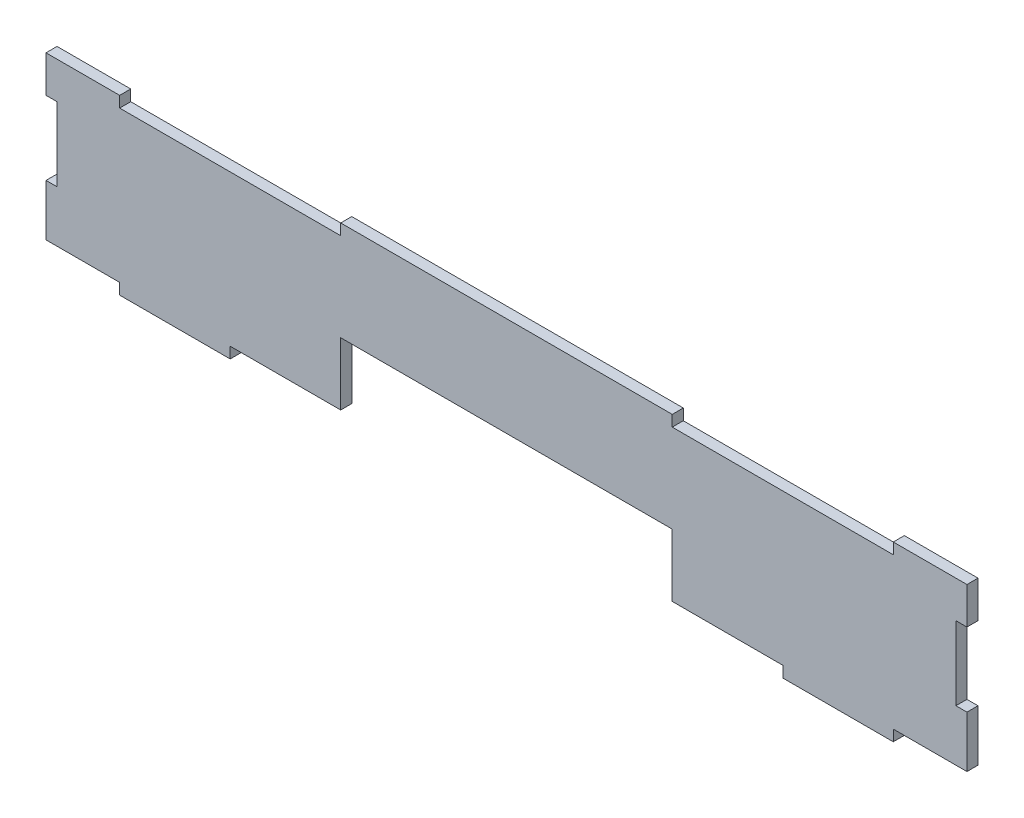
ISO-10303-21;
HEADER;
FILE_DESCRIPTION(('STEP AP214'),'2;1');
FILE_NAME('part.step','',(''),(''),'','','');
FILE_SCHEMA(('AUTOMOTIVE_DESIGN { 1 0 10303 214 1 1 1 1 }'));
ENDSEC;
DATA;
#1=APPLICATION_CONTEXT('core data for automotive mechanical design processes');
#2=APPLICATION_PROTOCOL_DEFINITION('international standard','automotive_design',2000,#1);
#3=PRODUCT_CONTEXT('',#1,'mechanical');
#4=PRODUCT('Part','Part','',(#3));
#5=PRODUCT_RELATED_PRODUCT_CATEGORY('part','',(#4));
#6=PRODUCT_DEFINITION_FORMATION('','',#4);
#7=PRODUCT_DEFINITION_CONTEXT('part definition',#1,'design');
#8=PRODUCT_DEFINITION('design','',#6,#7);
#9=PRODUCT_DEFINITION_SHAPE('','',#8);
#10=(LENGTH_UNIT() NAMED_UNIT(*) SI_UNIT(.MILLI.,.METRE.));
#11=(NAMED_UNIT(*) PLANE_ANGLE_UNIT() SI_UNIT($,.RADIAN.));
#12=(NAMED_UNIT(*) SI_UNIT($,.STERADIAN.) SOLID_ANGLE_UNIT());
#13=UNCERTAINTY_MEASURE_WITH_UNIT(LENGTH_MEASURE(1.E-05),#10,'distance_accuracy_value','');
#14=(GEOMETRIC_REPRESENTATION_CONTEXT(3) GLOBAL_UNCERTAINTY_ASSIGNED_CONTEXT((#13)) GLOBAL_UNIT_ASSIGNED_CONTEXT((#10,
#11,#12)) REPRESENTATION_CONTEXT('',''));
#15=CARTESIAN_POINT('',(0.,0.,0.));
#16=DIRECTION('',(0.,0.,1.));
#17=DIRECTION('',(1.,0.,0.));
#18=AXIS2_PLACEMENT_3D('',#15,#16,#17);
#19=CARTESIAN_POINT('',(0.,0.,3.));
#20=DIRECTION('',(0.,1.,0.));
#21=DIRECTION('',(0.,0.,1.));
#22=AXIS2_PLACEMENT_3D('',#19,#20,#21);
#23=PLANE('',#22);
#24=DIRECTION('',(1.,0.,0.));
#25=VECTOR('',#24,1.);
#26=CARTESIAN_POINT('',(0.,0.,0.));
#27=LINE('',#26,#25);
#28=CARTESIAN_POINT('',(20.,0.,0.));
#29=VERTEX_POINT('',#28);
#30=CARTESIAN_POINT('',(50.,0.,0.));
#31=VERTEX_POINT('',#30);
#32=EDGE_CURVE('E286',#29,#31,#27,.T.);
#33=ORIENTED_EDGE('',*,*,#32,.T.);
#34=DIRECTION('',(0.,0.,1.));
#35=VECTOR('',#34,1.);
#36=CARTESIAN_POINT('',(50.,0.,-7.));
#37=LINE('',#36,#35);
#38=CARTESIAN_POINT('',(50.,0.,3.));
#39=VERTEX_POINT('',#38);
#40=EDGE_CURVE('E542',#31,#39,#37,.T.);
#41=ORIENTED_EDGE('',*,*,#40,.T.);
#42=DIRECTION('',(1.,0.,0.));
#43=VECTOR('',#42,1.);
#44=CARTESIAN_POINT('',(0.,0.,3.));
#45=LINE('',#44,#43);
#46=CARTESIAN_POINT('',(20.,0.,3.));
#47=VERTEX_POINT('',#46);
#48=EDGE_CURVE('E263',#47,#39,#45,.T.);
#49=ORIENTED_EDGE('',*,*,#48,.F.);
#50=DIRECTION('',(0.,0.,1.));
#51=VECTOR('',#50,1.);
#52=CARTESIAN_POINT('',(20.,0.,-7.));
#53=LINE('',#52,#51);
#54=EDGE_CURVE('E337',#29,#47,#53,.T.);
#55=ORIENTED_EDGE('',*,*,#54,.F.);
#56=EDGE_LOOP('',(#33,#41,#49,#55));
#57=FACE_BOUND('',#56,.T.);
#58=ADVANCED_FACE('F33',(#57),#23,.F.);
#59=CARTESIAN_POINT('',(0.,46.98,3.));
#60=DIRECTION('',(0.,-1.,0.));
#61=DIRECTION('',(0.,0.,-1.));
#62=AXIS2_PLACEMENT_3D('',#59,#60,#61);
#63=PLANE('',#62);
#64=DIRECTION('',(-1.,0.,0.));
#65=VECTOR('',#64,1.);
#66=CARTESIAN_POINT('',(0.,46.98,0.));
#67=LINE('',#66,#65);
#68=CARTESIAN_POINT('',(250.,46.98,0.));
#69=VERTEX_POINT('',#68);
#70=CARTESIAN_POINT('',(230.,46.98,0.));
#71=VERTEX_POINT('',#70);
#72=EDGE_CURVE('E293',#69,#71,#67,.T.);
#73=ORIENTED_EDGE('',*,*,#72,.T.);
#74=DIRECTION('',(0.,0.,1.));
#75=VECTOR('',#74,1.);
#76=CARTESIAN_POINT('',(230.,46.98,0.));
#77=LINE('',#76,#75);
#78=CARTESIAN_POINT('',(230.,46.98,3.));
#79=VERTEX_POINT('',#78);
#80=EDGE_CURVE('E362',#71,#79,#77,.T.);
#81=ORIENTED_EDGE('',*,*,#80,.T.);
#82=DIRECTION('',(-1.,0.,0.));
#83=VECTOR('',#82,1.);
#84=CARTESIAN_POINT('',(0.,46.98,3.));
#85=LINE('',#84,#83);
#86=CARTESIAN_POINT('',(250.,46.98,3.));
#87=VERTEX_POINT('',#86);
#88=EDGE_CURVE('E276',#87,#79,#85,.T.);
#89=ORIENTED_EDGE('',*,*,#88,.F.);
#90=DIRECTION('',(0.,0.,-1.));
#91=VECTOR('',#90,1.);
#92=CARTESIAN_POINT('',(250.,46.98,3.));
#93=LINE('',#92,#91);
#94=EDGE_CURVE('E299',#87,#69,#93,.T.);
#95=ORIENTED_EDGE('',*,*,#94,.T.);
#96=EDGE_LOOP('',(#73,#81,#89,#95));
#97=FACE_BOUND('',#96,.T.);
#98=ADVANCED_FACE('F470',(#97),#63,.F.);
#99=CARTESIAN_POINT('',(20.,46.98,3.));
#100=VERTEX_POINT('',#99);
#101=CARTESIAN_POINT('',(0.,46.98,3.));
#102=VERTEX_POINT('',#101);
#103=EDGE_CURVE('E275',#100,#102,#85,.T.);
#104=ORIENTED_EDGE('',*,*,#103,.F.);
#105=DIRECTION('',(0.,0.,1.));
#106=VECTOR('',#105,1.);
#107=CARTESIAN_POINT('',(20.,46.98,0.));
#108=LINE('',#107,#106);
#109=CARTESIAN_POINT('',(20.,46.98,0.));
#110=VERTEX_POINT('',#109);
#111=EDGE_CURVE('E396',#110,#100,#108,.T.);
#112=ORIENTED_EDGE('',*,*,#111,.F.);
#113=CARTESIAN_POINT('',(0.,46.98,0.));
#114=VERTEX_POINT('',#113);
#115=EDGE_CURVE('E292',#110,#114,#67,.T.);
#116=ORIENTED_EDGE('',*,*,#115,.T.);
#117=DIRECTION('',(0.,0.,-1.));
#118=VECTOR('',#117,1.);
#119=CARTESIAN_POINT('',(0.,46.98,3.));
#120=LINE('',#119,#118);
#121=EDGE_CURVE('E279',#102,#114,#120,.T.);
#122=ORIENTED_EDGE('',*,*,#121,.F.);
#123=EDGE_LOOP('',(#104,#112,#116,#122));
#124=FACE_BOUND('',#123,.T.);
#125=ADVANCED_FACE('F497',(#124),#63,.F.);
#126=CARTESIAN_POINT('',(0.,0.,3.));
#127=DIRECTION('',(1.,0.,0.));
#128=DIRECTION('',(0.,0.,-1.));
#129=AXIS2_PLACEMENT_3D('',#126,#127,#128);
#130=PLANE('',#129);
#131=DIRECTION('',(0.,-1.,0.));
#132=VECTOR('',#131,1.);
#133=CARTESIAN_POINT('',(0.,0.,0.));
#134=LINE('',#133,#132);
#135=CARTESIAN_POINT('',(0.,36.98,0.));
#136=VERTEX_POINT('',#135);
#137=EDGE_CURVE('E281',#114,#136,#134,.T.);
#138=ORIENTED_EDGE('',*,*,#137,.T.);
#139=DIRECTION('',(0.,0.,1.));
#140=VECTOR('',#139,1.);
#141=CARTESIAN_POINT('',(0.,36.98,0.));
#142=LINE('',#141,#140);
#143=CARTESIAN_POINT('',(0.,36.98,3.));
#144=VERTEX_POINT('',#143);
#145=EDGE_CURVE('E422',#136,#144,#142,.T.);
#146=ORIENTED_EDGE('',*,*,#145,.T.);
#147=DIRECTION('',(0.,-1.,0.));
#148=VECTOR('',#147,1.);
#149=CARTESIAN_POINT('',(0.,0.,3.));
#150=LINE('',#149,#148);
#151=EDGE_CURVE('E264',#102,#144,#150,.T.);
#152=ORIENTED_EDGE('',*,*,#151,.F.);
#153=ORIENTED_EDGE('',*,*,#121,.T.);
#154=EDGE_LOOP('',(#138,#146,#152,#153));
#155=FACE_BOUND('',#154,.T.);
#156=ADVANCED_FACE('F501',(#155),#130,.F.);
#157=CARTESIAN_POINT('',(250.,0.,3.));
#158=DIRECTION('',(-1.,0.,0.));
#159=DIRECTION('',(0.,0.,1.));
#160=AXIS2_PLACEMENT_3D('',#157,#158,#159);
#161=PLANE('',#160);
#162=DIRECTION('',(0.,1.,0.));
#163=VECTOR('',#162,1.);
#164=CARTESIAN_POINT('',(250.,0.,3.));
#165=LINE('',#164,#163);
#166=CARTESIAN_POINT('',(250.,3.,3.));
#167=VERTEX_POINT('',#166);
#168=CARTESIAN_POINT('',(250.,16.98,3.));
#169=VERTEX_POINT('',#168);
#170=EDGE_CURVE('E273',#167,#169,#165,.T.);
#171=ORIENTED_EDGE('',*,*,#170,.F.);
#172=DIRECTION('',(0.,0.,1.));
#173=VECTOR('',#172,1.);
#174=CARTESIAN_POINT('',(250.,3.,-7.));
#175=LINE('',#174,#173);
#176=CARTESIAN_POINT('',(250.,3.,0.));
#177=VERTEX_POINT('',#176);
#178=EDGE_CURVE('E551',#177,#167,#175,.T.);
#179=ORIENTED_EDGE('',*,*,#178,.F.);
#180=DIRECTION('',(0.,1.,0.));
#181=VECTOR('',#180,1.);
#182=CARTESIAN_POINT('',(250.,0.,0.));
#183=LINE('',#182,#181);
#184=CARTESIAN_POINT('',(250.,16.98,0.));
#185=VERTEX_POINT('',#184);
#186=EDGE_CURVE('E290',#177,#185,#183,.T.);
#187=ORIENTED_EDGE('',*,*,#186,.T.);
#188=DIRECTION('',(0.,0.,1.));
#189=VECTOR('',#188,1.);
#190=CARTESIAN_POINT('',(250.,16.98,0.));
#191=LINE('',#190,#189);
#192=EDGE_CURVE('E449',#185,#169,#191,.T.);
#193=ORIENTED_EDGE('',*,*,#192,.T.);
#194=EDGE_LOOP('',(#171,#179,#187,#193));
#195=FACE_BOUND('',#194,.T.);
#196=ADVANCED_FACE('F571',(#195),#161,.F.);
#197=CARTESIAN_POINT('',(0.,16.98,0.));
#198=VERTEX_POINT('',#197);
#199=CARTESIAN_POINT('',(0.,3.,0.));
#200=VERTEX_POINT('',#199);
#201=EDGE_CURVE('E285',#198,#200,#134,.T.);
#202=ORIENTED_EDGE('',*,*,#201,.T.);
#203=DIRECTION('',(0.,0.,1.));
#204=VECTOR('',#203,1.);
#205=CARTESIAN_POINT('',(0.,3.,-7.));
#206=LINE('',#205,#204);
#207=CARTESIAN_POINT('',(0.,3.,3.));
#208=VERTEX_POINT('',#207);
#209=EDGE_CURVE('E328',#200,#208,#206,.T.);
#210=ORIENTED_EDGE('',*,*,#209,.T.);
#211=CARTESIAN_POINT('',(0.,16.98,3.));
#212=VERTEX_POINT('',#211);
#213=EDGE_CURVE('E269',#212,#208,#150,.T.);
#214=ORIENTED_EDGE('',*,*,#213,.F.);
#215=DIRECTION('',(0.,0.,1.));
#216=VECTOR('',#215,1.);
#217=CARTESIAN_POINT('',(0.,16.98,0.));
#218=LINE('',#217,#216);
#219=EDGE_CURVE('E415',#198,#212,#218,.T.);
#220=ORIENTED_EDGE('',*,*,#219,.F.);
#221=EDGE_LOOP('',(#202,#210,#214,#220));
#222=FACE_BOUND('',#221,.T.);
#223=ADVANCED_FACE('F35',(#222),#130,.F.);
#224=CARTESIAN_POINT('',(200.,0.,3.));
#225=VERTEX_POINT('',#224);
#226=CARTESIAN_POINT('',(230.,0.,3.));
#227=VERTEX_POINT('',#226);
#228=EDGE_CURVE('E256',#225,#227,#45,.T.);
#229=ORIENTED_EDGE('',*,*,#228,.F.);
#230=DIRECTION('',(0.,0.,1.));
#231=VECTOR('',#230,1.);
#232=CARTESIAN_POINT('',(200.,0.,-7.));
#233=LINE('',#232,#231);
#234=CARTESIAN_POINT('',(200.,0.,0.));
#235=VERTEX_POINT('',#234);
#236=EDGE_CURVE('E241',#235,#225,#233,.T.);
#237=ORIENTED_EDGE('',*,*,#236,.F.);
#238=CARTESIAN_POINT('',(230.,0.,0.));
#239=VERTEX_POINT('',#238);
#240=EDGE_CURVE('E284',#235,#239,#27,.T.);
#241=ORIENTED_EDGE('',*,*,#240,.T.);
#242=DIRECTION('',(0.,0.,1.));
#243=VECTOR('',#242,1.);
#244=CARTESIAN_POINT('',(230.,0.,-7.));
#245=LINE('',#244,#243);
#246=EDGE_CURVE('E262',#239,#227,#245,.T.);
#247=ORIENTED_EDGE('',*,*,#246,.T.);
#248=EDGE_LOOP('',(#229,#237,#241,#247));
#249=FACE_BOUND('',#248,.T.);
#250=ADVANCED_FACE('F260',(#249),#23,.F.);
#251=CARTESIAN_POINT('',(250.,36.98,3.));
#252=VERTEX_POINT('',#251);
#253=EDGE_CURVE('E267',#252,#87,#165,.T.);
#254=ORIENTED_EDGE('',*,*,#253,.F.);
#255=DIRECTION('',(0.,0.,1.));
#256=VECTOR('',#255,1.);
#257=CARTESIAN_POINT('',(250.,36.98,0.));
#258=LINE('',#257,#256);
#259=CARTESIAN_POINT('',(250.,36.98,0.));
#260=VERTEX_POINT('',#259);
#261=EDGE_CURVE('E441',#260,#252,#258,.T.);
#262=ORIENTED_EDGE('',*,*,#261,.F.);
#263=EDGE_CURVE('E289',#260,#69,#183,.T.);
#264=ORIENTED_EDGE('',*,*,#263,.T.);
#265=ORIENTED_EDGE('',*,*,#94,.F.);
#266=EDGE_LOOP('',(#254,#262,#264,#265));
#267=FACE_BOUND('',#266,.T.);
#268=ADVANCED_FACE('F466',(#267),#161,.F.);
#269=CARTESIAN_POINT('',(170.,46.98,3.));
#270=VERTEX_POINT('',#269);
#271=CARTESIAN_POINT('',(80.,46.98,3.));
#272=VERTEX_POINT('',#271);
#273=EDGE_CURVE('E280',#270,#272,#85,.T.);
#274=ORIENTED_EDGE('',*,*,#273,.F.);
#275=DIRECTION('',(0.,0.,1.));
#276=VECTOR('',#275,1.);
#277=CARTESIAN_POINT('',(170.,46.98,0.));
#278=LINE('',#277,#276);
#279=CARTESIAN_POINT('',(170.,46.98,0.));
#280=VERTEX_POINT('',#279);
#281=EDGE_CURVE('E374',#280,#270,#278,.T.);
#282=ORIENTED_EDGE('',*,*,#281,.F.);
#283=CARTESIAN_POINT('',(80.,46.98,0.));
#284=VERTEX_POINT('',#283);
#285=EDGE_CURVE('E296',#280,#284,#67,.T.);
#286=ORIENTED_EDGE('',*,*,#285,.T.);
#287=DIRECTION('',(0.,0.,1.));
#288=VECTOR('',#287,1.);
#289=CARTESIAN_POINT('',(80.,46.98,0.));
#290=LINE('',#289,#288);
#291=EDGE_CURVE('E399',#284,#272,#290,.T.);
#292=ORIENTED_EDGE('',*,*,#291,.T.);
#293=EDGE_LOOP('',(#274,#282,#286,#292));
#294=FACE_BOUND('',#293,.T.);
#295=ADVANCED_FACE('F486',(#294),#63,.F.);
#296=CARTESIAN_POINT('',(0.,0.,3.));
#297=DIRECTION('',(0.,0.,-1.));
#298=DIRECTION('',(-1.,0.,0.));
#299=AXIS2_PLACEMENT_3D('',#296,#297,#298);
#300=PLANE('',#299);
#301=DIRECTION('',(0.,1.,0.));
#302=VECTOR('',#301,1.);
#303=CARTESIAN_POINT('',(170.,0.,3.));
#304=LINE('',#303,#302);
#305=CARTESIAN_POINT('',(170.,3.00000000000001,3.));
#306=VERTEX_POINT('',#305);
#307=CARTESIAN_POINT('',(170.,20.,3.));
#308=VERTEX_POINT('',#307);
#309=EDGE_CURVE('E318',#306,#308,#304,.T.);
#310=ORIENTED_EDGE('',*,*,#309,.F.);
#311=DIRECTION('',(-1.,0.,0.));
#312=VECTOR('',#311,1.);
#313=CARTESIAN_POINT('',(170.,3.,3.));
#314=LINE('',#313,#312);
#315=CARTESIAN_POINT('',(200.,3.00000000000001,3.));
#316=VERTEX_POINT('',#315);
#317=EDGE_CURVE('E48',#316,#306,#314,.T.);
#318=ORIENTED_EDGE('',*,*,#317,.F.);
#319=DIRECTION('',(0.,1.,0.));
#320=VECTOR('',#319,1.);
#321=CARTESIAN_POINT('',(200.,0.,3.));
#322=LINE('',#321,#320);
#323=EDGE_CURVE('E245',#225,#316,#322,.T.);
#324=ORIENTED_EDGE('',*,*,#323,.F.);
#325=ORIENTED_EDGE('',*,*,#228,.T.);
#326=DIRECTION('',(0.,-1.,0.));
#327=VECTOR('',#326,1.);
#328=CARTESIAN_POINT('',(230.,0.,3.));
#329=LINE('',#328,#327);
#330=CARTESIAN_POINT('',(230.,3.,3.));
#331=VERTEX_POINT('',#330);
#332=EDGE_CURVE('E553',#331,#227,#329,.T.);
#333=ORIENTED_EDGE('',*,*,#332,.F.);
#334=DIRECTION('',(-1.,0.,0.));
#335=VECTOR('',#334,1.);
#336=CARTESIAN_POINT('',(250.,3.,3.));
#337=LINE('',#336,#335);
#338=EDGE_CURVE('E557',#167,#331,#337,.T.);
#339=ORIENTED_EDGE('',*,*,#338,.F.);
#340=ORIENTED_EDGE('',*,*,#170,.T.);
#341=DIRECTION('',(1.,0.,0.));
#342=VECTOR('',#341,1.);
#343=CARTESIAN_POINT('',(250.,16.98,3.));
#344=LINE('',#343,#342);
#345=CARTESIAN_POINT('',(247.,16.98,3.));
#346=VERTEX_POINT('',#345);
#347=EDGE_CURVE('E435',#346,#169,#344,.T.);
#348=ORIENTED_EDGE('',*,*,#347,.F.);
#349=DIRECTION('',(0.,-1.,0.));
#350=VECTOR('',#349,1.);
#351=CARTESIAN_POINT('',(247.,36.98,3.));
#352=LINE('',#351,#350);
#353=CARTESIAN_POINT('',(247.,36.98,3.));
#354=VERTEX_POINT('',#353);
#355=EDGE_CURVE('E444',#354,#346,#352,.T.);
#356=ORIENTED_EDGE('',*,*,#355,.F.);
#357=DIRECTION('',(-1.,0.,0.));
#358=VECTOR('',#357,1.);
#359=CARTESIAN_POINT('',(250.,36.98,3.));
#360=LINE('',#359,#358);
#361=EDGE_CURVE('E425',#252,#354,#360,.T.);
#362=ORIENTED_EDGE('',*,*,#361,.F.);
#363=ORIENTED_EDGE('',*,*,#253,.T.);
#364=ORIENTED_EDGE('',*,*,#88,.T.);
#365=DIRECTION('',(0.,1.,0.));
#366=VECTOR('',#365,1.);
#367=CARTESIAN_POINT('',(230.,46.98,3.));
#368=LINE('',#367,#366);
#369=CARTESIAN_POINT('',(230.,43.98,3.));
#370=VERTEX_POINT('',#369);
#371=EDGE_CURVE('E351',#370,#79,#368,.T.);
#372=ORIENTED_EDGE('',*,*,#371,.F.);
#373=DIRECTION('',(1.,0.,0.));
#374=VECTOR('',#373,1.);
#375=CARTESIAN_POINT('',(230.,43.98,3.));
#376=LINE('',#375,#374);
#377=CARTESIAN_POINT('',(170.,43.98,3.));
#378=VERTEX_POINT('',#377);
#379=EDGE_CURVE('E356',#378,#370,#376,.T.);
#380=ORIENTED_EDGE('',*,*,#379,.F.);
#381=DIRECTION('',(0.,-1.,0.));
#382=VECTOR('',#381,1.);
#383=CARTESIAN_POINT('',(170.,46.98,3.));
#384=LINE('',#383,#382);
#385=EDGE_CURVE('E364',#270,#378,#384,.T.);
#386=ORIENTED_EDGE('',*,*,#385,.F.);
#387=ORIENTED_EDGE('',*,*,#273,.T.);
#388=DIRECTION('',(0.,1.,0.));
#389=VECTOR('',#388,1.);
#390=CARTESIAN_POINT('',(80.,46.98,3.));
#391=LINE('',#390,#389);
#392=CARTESIAN_POINT('',(80.,43.98,3.));
#393=VERTEX_POINT('',#392);
#394=EDGE_CURVE('E382',#393,#272,#391,.T.);
#395=ORIENTED_EDGE('',*,*,#394,.F.);
#396=DIRECTION('',(1.,0.,0.));
#397=VECTOR('',#396,1.);
#398=CARTESIAN_POINT('',(20.,43.98,3.));
#399=LINE('',#398,#397);
#400=CARTESIAN_POINT('',(20.,43.98,3.));
#401=VERTEX_POINT('',#400);
#402=EDGE_CURVE('E391',#401,#393,#399,.T.);
#403=ORIENTED_EDGE('',*,*,#402,.F.);
#404=DIRECTION('',(0.,-1.,0.));
#405=VECTOR('',#404,1.);
#406=CARTESIAN_POINT('',(20.,46.98,3.));
#407=LINE('',#406,#405);
#408=EDGE_CURVE('E371',#100,#401,#407,.T.);
#409=ORIENTED_EDGE('',*,*,#408,.F.);
#410=ORIENTED_EDGE('',*,*,#103,.T.);
#411=ORIENTED_EDGE('',*,*,#151,.T.);
#412=DIRECTION('',(-1.,0.,0.));
#413=VECTOR('',#412,1.);
#414=CARTESIAN_POINT('',(0.,36.98,3.));
#415=LINE('',#414,#413);
#416=CARTESIAN_POINT('',(3.,36.98,3.));
#417=VERTEX_POINT('',#416);
#418=EDGE_CURVE('E409',#417,#144,#415,.T.);
#419=ORIENTED_EDGE('',*,*,#418,.F.);
#420=DIRECTION('',(0.,1.,0.));
#421=VECTOR('',#420,1.);
#422=CARTESIAN_POINT('',(3.,36.98,3.));
#423=LINE('',#422,#421);
#424=CARTESIAN_POINT('',(3.,16.98,3.));
#425=VERTEX_POINT('',#424);
#426=EDGE_CURVE('E418',#425,#417,#423,.T.);
#427=ORIENTED_EDGE('',*,*,#426,.F.);
#428=DIRECTION('',(1.,0.,0.));
#429=VECTOR('',#428,1.);
#430=CARTESIAN_POINT('',(0.,16.98,3.));
#431=LINE('',#430,#429);
#432=EDGE_CURVE('E398',#212,#425,#431,.T.);
#433=ORIENTED_EDGE('',*,*,#432,.F.);
#434=ORIENTED_EDGE('',*,*,#213,.T.);
#435=DIRECTION('',(-1.,0.,0.));
#436=VECTOR('',#435,1.);
#437=CARTESIAN_POINT('',(0.,3.,3.));
#438=LINE('',#437,#436);
#439=CARTESIAN_POINT('',(20.,3.,3.));
#440=VERTEX_POINT('',#439);
#441=EDGE_CURVE('E525',#440,#208,#438,.T.);
#442=ORIENTED_EDGE('',*,*,#441,.F.);
#443=DIRECTION('',(0.,1.,0.));
#444=VECTOR('',#443,1.);
#445=CARTESIAN_POINT('',(20.,0.,3.));
#446=LINE('',#445,#444);
#447=EDGE_CURVE('E536',#47,#440,#446,.T.);
#448=ORIENTED_EDGE('',*,*,#447,.F.);
#449=ORIENTED_EDGE('',*,*,#48,.T.);
#450=DIRECTION('',(0.,-1.,0.));
#451=VECTOR('',#450,1.);
#452=CARTESIAN_POINT('',(50.,0.,3.));
#453=LINE('',#452,#451);
#454=CARTESIAN_POINT('',(50.,3.,3.));
#455=VERTEX_POINT('',#454);
#456=EDGE_CURVE('E545',#455,#39,#453,.T.);
#457=ORIENTED_EDGE('',*,*,#456,.F.);
#458=DIRECTION('',(-1.,0.,0.));
#459=VECTOR('',#458,1.);
#460=CARTESIAN_POINT('',(80.,3.,3.));
#461=LINE('',#460,#459);
#462=CARTESIAN_POINT('',(80.,3.,3.));
#463=VERTEX_POINT('',#462);
#464=EDGE_CURVE('E548',#463,#455,#461,.T.);
#465=ORIENTED_EDGE('',*,*,#464,.F.);
#466=DIRECTION('',(0.,-1.,0.));
#467=VECTOR('',#466,1.);
#468=CARTESIAN_POINT('',(80.,0.,3.));
#469=LINE('',#468,#467);
#470=CARTESIAN_POINT('',(80.,20.,3.));
#471=VERTEX_POINT('',#470);
#472=EDGE_CURVE('E327',#471,#463,#469,.T.);
#473=ORIENTED_EDGE('',*,*,#472,.F.);
#474=DIRECTION('',(-1.,0.,0.));
#475=VECTOR('',#474,1.);
#476=CARTESIAN_POINT('',(80.,20.,3.));
#477=LINE('',#476,#475);
#478=EDGE_CURVE('E326',#308,#471,#477,.T.);
#479=ORIENTED_EDGE('',*,*,#478,.F.);
#480=EDGE_LOOP('',(#310,#318,#324,#325,#333,#339,#340,#348,#356,#362,#363,#364,#372,#380,#386,
#387,#395,#403,#409,#410,#411,#419,#427,#433,#434,#442,#448,#449,#457,#465,#473,#479));
#481=FACE_BOUND('',#480,.T.);
#482=ADVANCED_FACE('F254',(#481),#300,.F.);
#483=CARTESIAN_POINT('',(0.,0.,0.));
#484=DIRECTION('',(0.,0.,-1.));
#485=DIRECTION('',(-1.,0.,0.));
#486=AXIS2_PLACEMENT_3D('',#483,#484,#485);
#487=PLANE('',#486);
#488=DIRECTION('',(1.,0.,0.));
#489=VECTOR('',#488,1.);
#490=CARTESIAN_POINT('',(0.,2.99999999999994,0.));
#491=LINE('',#490,#489);
#492=CARTESIAN_POINT('',(170.,3.,0.));
#493=VERTEX_POINT('',#492);
#494=CARTESIAN_POINT('',(200.,3.00000000000001,0.));
#495=VERTEX_POINT('',#494);
#496=EDGE_CURVE('E559',#493,#495,#491,.T.);
#497=ORIENTED_EDGE('',*,*,#496,.F.);
#498=DIRECTION('',(0.,-1.,0.));
#499=VECTOR('',#498,1.);
#500=CARTESIAN_POINT('',(170.,0.,0.));
#501=LINE('',#500,#499);
#502=CARTESIAN_POINT('',(170.,20.,0.));
#503=VERTEX_POINT('',#502);
#504=EDGE_CURVE('E321',#503,#493,#501,.T.);
#505=ORIENTED_EDGE('',*,*,#504,.F.);
#506=DIRECTION('',(1.,0.,0.));
#507=VECTOR('',#506,1.);
#508=CARTESIAN_POINT('',(80.,20.,0.));
#509=LINE('',#508,#507);
#510=CARTESIAN_POINT('',(80.,20.,0.));
#511=VERTEX_POINT('',#510);
#512=EDGE_CURVE('E341',#511,#503,#509,.T.);
#513=ORIENTED_EDGE('',*,*,#512,.F.);
#514=DIRECTION('',(0.,1.,0.));
#515=VECTOR('',#514,1.);
#516=CARTESIAN_POINT('',(80.,0.,0.));
#517=LINE('',#516,#515);
#518=CARTESIAN_POINT('',(80.,3.,0.));
#519=VERTEX_POINT('',#518);
#520=EDGE_CURVE('E331',#519,#511,#517,.T.);
#521=ORIENTED_EDGE('',*,*,#520,.F.);
#522=DIRECTION('',(1.,0.,0.));
#523=VECTOR('',#522,1.);
#524=CARTESIAN_POINT('',(0.,2.99999999999999,0.));
#525=LINE('',#524,#523);
#526=CARTESIAN_POINT('',(50.,3.,0.));
#527=VERTEX_POINT('',#526);
#528=EDGE_CURVE('E538',#527,#519,#525,.T.);
#529=ORIENTED_EDGE('',*,*,#528,.F.);
#530=DIRECTION('',(0.,1.,0.));
#531=VECTOR('',#530,1.);
#532=CARTESIAN_POINT('',(50.,0.,0.));
#533=LINE('',#532,#531);
#534=EDGE_CURVE('E310',#31,#527,#533,.T.);
#535=ORIENTED_EDGE('',*,*,#534,.F.);
#536=ORIENTED_EDGE('',*,*,#32,.F.);
#537=DIRECTION('',(0.,-1.,0.));
#538=VECTOR('',#537,1.);
#539=CARTESIAN_POINT('',(20.,0.,0.));
#540=LINE('',#539,#538);
#541=CARTESIAN_POINT('',(20.,3.,0.));
#542=VERTEX_POINT('',#541);
#543=EDGE_CURVE('E302',#542,#29,#540,.T.);
#544=ORIENTED_EDGE('',*,*,#543,.F.);
#545=DIRECTION('',(1.,0.,0.));
#546=VECTOR('',#545,1.);
#547=CARTESIAN_POINT('',(0.,3.,0.));
#548=LINE('',#547,#546);
#549=EDGE_CURVE('E304',#200,#542,#548,.T.);
#550=ORIENTED_EDGE('',*,*,#549,.F.);
#551=ORIENTED_EDGE('',*,*,#201,.F.);
#552=DIRECTION('',(1.,0.,0.));
#553=VECTOR('',#552,1.);
#554=CARTESIAN_POINT('',(0.,16.98,0.));
#555=LINE('',#554,#553);
#556=CARTESIAN_POINT('',(3.,16.98,0.));
#557=VERTEX_POINT('',#556);
#558=EDGE_CURVE('E405',#198,#557,#555,.T.);
#559=ORIENTED_EDGE('',*,*,#558,.T.);
#560=DIRECTION('',(0.,1.,0.));
#561=VECTOR('',#560,1.);
#562=CARTESIAN_POINT('',(3.,36.98,0.));
#563=LINE('',#562,#561);
#564=CARTESIAN_POINT('',(3.,36.98,0.));
#565=VERTEX_POINT('',#564);
#566=EDGE_CURVE('E408',#557,#565,#563,.T.);
#567=ORIENTED_EDGE('',*,*,#566,.T.);
#568=DIRECTION('',(-1.,0.,0.));
#569=VECTOR('',#568,1.);
#570=CARTESIAN_POINT('',(0.,36.98,0.));
#571=LINE('',#570,#569);
#572=EDGE_CURVE('E412',#565,#136,#571,.T.);
#573=ORIENTED_EDGE('',*,*,#572,.T.);
#574=ORIENTED_EDGE('',*,*,#137,.F.);
#575=ORIENTED_EDGE('',*,*,#115,.F.);
#576=DIRECTION('',(0.,-1.,0.));
#577=VECTOR('',#576,1.);
#578=CARTESIAN_POINT('',(20.,46.98,0.));
#579=LINE('',#578,#577);
#580=CARTESIAN_POINT('',(20.,43.98,0.));
#581=VERTEX_POINT('',#580);
#582=EDGE_CURVE('E378',#110,#581,#579,.T.);
#583=ORIENTED_EDGE('',*,*,#582,.T.);
#584=DIRECTION('',(1.,0.,0.));
#585=VECTOR('',#584,1.);
#586=CARTESIAN_POINT('',(20.,43.98,0.));
#587=LINE('',#586,#585);
#588=CARTESIAN_POINT('',(80.,43.98,0.));
#589=VERTEX_POINT('',#588);
#590=EDGE_CURVE('E381',#581,#589,#587,.T.);
#591=ORIENTED_EDGE('',*,*,#590,.T.);
#592=DIRECTION('',(0.,1.,0.));
#593=VECTOR('',#592,1.);
#594=CARTESIAN_POINT('',(80.,46.98,0.));
#595=LINE('',#594,#593);
#596=EDGE_CURVE('E385',#589,#284,#595,.T.);
#597=ORIENTED_EDGE('',*,*,#596,.T.);
#598=ORIENTED_EDGE('',*,*,#285,.F.);
#599=DIRECTION('',(0.,-1.,0.));
#600=VECTOR('',#599,1.);
#601=CARTESIAN_POINT('',(170.,46.98,0.));
#602=LINE('',#601,#600);
#603=CARTESIAN_POINT('',(170.,43.98,0.));
#604=VERTEX_POINT('',#603);
#605=EDGE_CURVE('E355',#280,#604,#602,.T.);
#606=ORIENTED_EDGE('',*,*,#605,.T.);
#607=DIRECTION('',(1.,0.,0.));
#608=VECTOR('',#607,1.);
#609=CARTESIAN_POINT('',(230.,43.98,0.));
#610=LINE('',#609,#608);
#611=CARTESIAN_POINT('',(230.,43.98,0.));
#612=VERTEX_POINT('',#611);
#613=EDGE_CURVE('E359',#604,#612,#610,.T.);
#614=ORIENTED_EDGE('',*,*,#613,.T.);
#615=DIRECTION('',(0.,1.,0.));
#616=VECTOR('',#615,1.);
#617=CARTESIAN_POINT('',(230.,46.98,0.));
#618=LINE('',#617,#616);
#619=EDGE_CURVE('E352',#612,#71,#618,.T.);
#620=ORIENTED_EDGE('',*,*,#619,.T.);
#621=ORIENTED_EDGE('',*,*,#72,.F.);
#622=ORIENTED_EDGE('',*,*,#263,.F.);
#623=DIRECTION('',(-1.,0.,0.));
#624=VECTOR('',#623,1.);
#625=CARTESIAN_POINT('',(250.,36.98,0.));
#626=LINE('',#625,#624);
#627=CARTESIAN_POINT('',(247.,36.98,0.));
#628=VERTEX_POINT('',#627);
#629=EDGE_CURVE('E431',#260,#628,#626,.T.);
#630=ORIENTED_EDGE('',*,*,#629,.T.);
#631=DIRECTION('',(0.,-1.,0.));
#632=VECTOR('',#631,1.);
#633=CARTESIAN_POINT('',(247.,36.98,0.));
#634=LINE('',#633,#632);
#635=CARTESIAN_POINT('',(247.,16.98,0.));
#636=VERTEX_POINT('',#635);
#637=EDGE_CURVE('E434',#628,#636,#634,.T.);
#638=ORIENTED_EDGE('',*,*,#637,.T.);
#639=DIRECTION('',(1.,0.,0.));
#640=VECTOR('',#639,1.);
#641=CARTESIAN_POINT('',(250.,16.98,0.));
#642=LINE('',#641,#640);
#643=EDGE_CURVE('E438',#636,#185,#642,.T.);
#644=ORIENTED_EDGE('',*,*,#643,.T.);
#645=ORIENTED_EDGE('',*,*,#186,.F.);
#646=DIRECTION('',(1.,0.,0.));
#647=VECTOR('',#646,1.);
#648=CARTESIAN_POINT('',(0.,2.99999999999997,0.));
#649=LINE('',#648,#647);
#650=CARTESIAN_POINT('',(230.,3.,0.));
#651=VERTEX_POINT('',#650);
#652=EDGE_CURVE('E312',#651,#177,#649,.T.);
#653=ORIENTED_EDGE('',*,*,#652,.F.);
#654=DIRECTION('',(0.,1.,0.));
#655=VECTOR('',#654,1.);
#656=CARTESIAN_POINT('',(230.,0.,0.));
#657=LINE('',#656,#655);
#658=EDGE_CURVE('E314',#239,#651,#657,.T.);
#659=ORIENTED_EDGE('',*,*,#658,.F.);
#660=ORIENTED_EDGE('',*,*,#240,.F.);
#661=DIRECTION('',(0.,-1.,0.));
#662=VECTOR('',#661,1.);
#663=CARTESIAN_POINT('',(200.,0.,0.));
#664=LINE('',#663,#662);
#665=EDGE_CURVE('E11',#495,#235,#664,.T.);
#666=ORIENTED_EDGE('',*,*,#665,.F.);
#667=EDGE_LOOP('',(#497,#505,#513,#521,#529,#535,#536,#544,#550,#551,#559,#567,#573,#574,#575,
#583,#591,#597,#598,#606,#614,#620,#621,#622,#630,#638,#644,#645,#653,#659,#660,#666));
#668=FACE_BOUND('',#667,.T.);
#669=ADVANCED_FACE('F506',(#668),#487,.T.);
#670=CARTESIAN_POINT('',(250.,16.98,0.));
#671=DIRECTION('',(0.,-1.,0.));
#672=DIRECTION('',(0.,0.,-1.));
#673=AXIS2_PLACEMENT_3D('',#670,#671,#672);
#674=PLANE('',#673);
#675=ORIENTED_EDGE('',*,*,#347,.T.);
#676=ORIENTED_EDGE('',*,*,#192,.F.);
#677=ORIENTED_EDGE('',*,*,#643,.F.);
#678=DIRECTION('',(0.,0.,1.));
#679=VECTOR('',#678,1.);
#680=CARTESIAN_POINT('',(247.,16.98,0.));
#681=LINE('',#680,#679);
#682=EDGE_CURVE('E452',#636,#346,#681,.T.);
#683=ORIENTED_EDGE('',*,*,#682,.T.);
#684=EDGE_LOOP('',(#675,#676,#677,#683));
#685=FACE_BOUND('',#684,.T.);
#686=ADVANCED_FACE('F576',(#685),#674,.F.);
#687=CARTESIAN_POINT('',(247.,36.98,0.));
#688=DIRECTION('',(-1.,0.,0.));
#689=DIRECTION('',(0.,0.,1.));
#690=AXIS2_PLACEMENT_3D('',#687,#688,#689);
#691=PLANE('',#690);
#692=ORIENTED_EDGE('',*,*,#355,.T.);
#693=ORIENTED_EDGE('',*,*,#682,.F.);
#694=ORIENTED_EDGE('',*,*,#637,.F.);
#695=DIRECTION('',(0.,0.,1.));
#696=VECTOR('',#695,1.);
#697=CARTESIAN_POINT('',(247.,36.98,0.));
#698=LINE('',#697,#696);
#699=EDGE_CURVE('E454',#628,#354,#698,.T.);
#700=ORIENTED_EDGE('',*,*,#699,.T.);
#701=EDGE_LOOP('',(#692,#693,#694,#700));
#702=FACE_BOUND('',#701,.T.);
#703=ADVANCED_FACE('F578',(#702),#691,.F.);
#704=CARTESIAN_POINT('',(250.,36.98,0.));
#705=DIRECTION('',(0.,1.,0.));
#706=DIRECTION('',(0.,0.,1.));
#707=AXIS2_PLACEMENT_3D('',#704,#705,#706);
#708=PLANE('',#707);
#709=ORIENTED_EDGE('',*,*,#361,.T.);
#710=ORIENTED_EDGE('',*,*,#699,.F.);
#711=ORIENTED_EDGE('',*,*,#629,.F.);
#712=ORIENTED_EDGE('',*,*,#261,.T.);
#713=EDGE_LOOP('',(#709,#710,#711,#712));
#714=FACE_BOUND('',#713,.T.);
#715=ADVANCED_FACE('F458',(#714),#708,.F.);
#716=CARTESIAN_POINT('',(0.,36.98,0.));
#717=DIRECTION('',(0.,1.,0.));
#718=DIRECTION('',(0.,0.,1.));
#719=AXIS2_PLACEMENT_3D('',#716,#717,#718);
#720=PLANE('',#719);
#721=ORIENTED_EDGE('',*,*,#418,.T.);
#722=ORIENTED_EDGE('',*,*,#145,.F.);
#723=ORIENTED_EDGE('',*,*,#572,.F.);
#724=DIRECTION('',(0.,0.,1.));
#725=VECTOR('',#724,1.);
#726=CARTESIAN_POINT('',(3.,36.98,0.));
#727=LINE('',#726,#725);
#728=EDGE_CURVE('E426',#565,#417,#727,.T.);
#729=ORIENTED_EDGE('',*,*,#728,.T.);
#730=EDGE_LOOP('',(#721,#722,#723,#729));
#731=FACE_BOUND('',#730,.T.);
#732=ADVANCED_FACE('F504',(#731),#720,.F.);
#733=CARTESIAN_POINT('',(3.,36.98,0.));
#734=DIRECTION('',(1.,0.,0.));
#735=DIRECTION('',(0.,1.,0.));
#736=AXIS2_PLACEMENT_3D('',#733,#734,#735);
#737=PLANE('',#736);
#738=ORIENTED_EDGE('',*,*,#426,.T.);
#739=ORIENTED_EDGE('',*,*,#728,.F.);
#740=ORIENTED_EDGE('',*,*,#566,.F.);
#741=DIRECTION('',(0.,0.,1.));
#742=VECTOR('',#741,1.);
#743=CARTESIAN_POINT('',(3.,16.98,0.));
#744=LINE('',#743,#742);
#745=EDGE_CURVE('E428',#557,#425,#744,.T.);
#746=ORIENTED_EDGE('',*,*,#745,.T.);
#747=EDGE_LOOP('',(#738,#739,#740,#746));
#748=FACE_BOUND('',#747,.T.);
#749=ADVANCED_FACE('F510',(#748),#737,.F.);
#750=CARTESIAN_POINT('',(0.,16.98,0.));
#751=DIRECTION('',(0.,-1.,0.));
#752=DIRECTION('',(0.,0.,-1.));
#753=AXIS2_PLACEMENT_3D('',#750,#751,#752);
#754=PLANE('',#753);
#755=ORIENTED_EDGE('',*,*,#432,.T.);
#756=ORIENTED_EDGE('',*,*,#745,.F.);
#757=ORIENTED_EDGE('',*,*,#558,.F.);
#758=ORIENTED_EDGE('',*,*,#219,.T.);
#759=EDGE_LOOP('',(#755,#756,#757,#758));
#760=FACE_BOUND('',#759,.T.);
#761=ADVANCED_FACE('F512',(#760),#754,.F.);
#762=CARTESIAN_POINT('',(20.,46.98,0.));
#763=DIRECTION('',(-1.,0.,0.));
#764=DIRECTION('',(0.,-1.,0.));
#765=AXIS2_PLACEMENT_3D('',#762,#763,#764);
#766=PLANE('',#765);
#767=ORIENTED_EDGE('',*,*,#408,.T.);
#768=DIRECTION('',(0.,0.,1.));
#769=VECTOR('',#768,1.);
#770=CARTESIAN_POINT('',(20.,43.98,0.));
#771=LINE('',#770,#769);
#772=EDGE_CURVE('E388',#581,#401,#771,.T.);
#773=ORIENTED_EDGE('',*,*,#772,.F.);
#774=ORIENTED_EDGE('',*,*,#582,.F.);
#775=ORIENTED_EDGE('',*,*,#111,.T.);
#776=EDGE_LOOP('',(#767,#773,#774,#775));
#777=FACE_BOUND('',#776,.T.);
#778=ADVANCED_FACE('F727',(#777),#766,.F.);
#779=CARTESIAN_POINT('',(80.,46.98,0.));
#780=DIRECTION('',(1.,0.,0.));
#781=DIRECTION('',(0.,1.,0.));
#782=AXIS2_PLACEMENT_3D('',#779,#780,#781);
#783=PLANE('',#782);
#784=ORIENTED_EDGE('',*,*,#394,.T.);
#785=ORIENTED_EDGE('',*,*,#291,.F.);
#786=ORIENTED_EDGE('',*,*,#596,.F.);
#787=DIRECTION('',(0.,0.,1.));
#788=VECTOR('',#787,1.);
#789=CARTESIAN_POINT('',(80.,43.98,0.));
#790=LINE('',#789,#788);
#791=EDGE_CURVE('E402',#589,#393,#790,.T.);
#792=ORIENTED_EDGE('',*,*,#791,.T.);
#793=EDGE_LOOP('',(#784,#785,#786,#792));
#794=FACE_BOUND('',#793,.T.);
#795=ADVANCED_FACE('F724',(#794),#783,.F.);
#796=CARTESIAN_POINT('',(20.,43.98,0.));
#797=DIRECTION('',(0.,-1.,0.));
#798=DIRECTION('',(1.,0.,0.));
#799=AXIS2_PLACEMENT_3D('',#796,#797,#798);
#800=PLANE('',#799);
#801=ORIENTED_EDGE('',*,*,#402,.T.);
#802=ORIENTED_EDGE('',*,*,#791,.F.);
#803=ORIENTED_EDGE('',*,*,#590,.F.);
#804=ORIENTED_EDGE('',*,*,#772,.T.);
#805=EDGE_LOOP('',(#801,#802,#803,#804));
#806=FACE_BOUND('',#805,.T.);
#807=ADVANCED_FACE('F723',(#806),#800,.F.);
#808=CARTESIAN_POINT('',(230.,46.98,0.));
#809=DIRECTION('',(1.,0.,0.));
#810=DIRECTION('',(0.,0.,-1.));
#811=AXIS2_PLACEMENT_3D('',#808,#809,#810);
#812=PLANE('',#811);
#813=ORIENTED_EDGE('',*,*,#371,.T.);
#814=ORIENTED_EDGE('',*,*,#80,.F.);
#815=ORIENTED_EDGE('',*,*,#619,.F.);
#816=DIRECTION('',(0.,0.,1.));
#817=VECTOR('',#816,1.);
#818=CARTESIAN_POINT('',(230.,43.98,0.));
#819=LINE('',#818,#817);
#820=EDGE_CURVE('E369',#612,#370,#819,.T.);
#821=ORIENTED_EDGE('',*,*,#820,.T.);
#822=EDGE_LOOP('',(#813,#814,#815,#821));
#823=FACE_BOUND('',#822,.T.);
#824=ADVANCED_FACE('F475',(#823),#812,.F.);
#825=CARTESIAN_POINT('',(230.,43.98,0.));
#826=DIRECTION('',(0.,-1.,0.));
#827=DIRECTION('',(1.,0.,0.));
#828=AXIS2_PLACEMENT_3D('',#825,#826,#827);
#829=PLANE('',#828);
#830=ORIENTED_EDGE('',*,*,#379,.T.);
#831=ORIENTED_EDGE('',*,*,#820,.F.);
#832=ORIENTED_EDGE('',*,*,#613,.F.);
#833=DIRECTION('',(0.,0.,1.));
#834=VECTOR('',#833,1.);
#835=CARTESIAN_POINT('',(170.,43.98,0.));
#836=LINE('',#835,#834);
#837=EDGE_CURVE('E372',#604,#378,#836,.T.);
#838=ORIENTED_EDGE('',*,*,#837,.T.);
#839=EDGE_LOOP('',(#830,#831,#832,#838));
#840=FACE_BOUND('',#839,.T.);
#841=ADVANCED_FACE('F478',(#840),#829,.F.);
#842=CARTESIAN_POINT('',(170.,46.98,0.));
#843=DIRECTION('',(-1.,0.,0.));
#844=DIRECTION('',(0.,0.,1.));
#845=AXIS2_PLACEMENT_3D('',#842,#843,#844);
#846=PLANE('',#845);
#847=ORIENTED_EDGE('',*,*,#385,.T.);
#848=ORIENTED_EDGE('',*,*,#837,.F.);
#849=ORIENTED_EDGE('',*,*,#605,.F.);
#850=ORIENTED_EDGE('',*,*,#281,.T.);
#851=EDGE_LOOP('',(#847,#848,#849,#850));
#852=FACE_BOUND('',#851,.T.);
#853=ADVANCED_FACE('F481',(#852),#846,.F.);
#854=CARTESIAN_POINT('',(80.,0.,3.001));
#855=DIRECTION('',(-1.,0.,0.));
#856=DIRECTION('',(0.,0.,1.));
#857=AXIS2_PLACEMENT_3D('',#854,#855,#856);
#858=PLANE('',#857);
#859=ORIENTED_EDGE('',*,*,#472,.T.);
#860=DIRECTION('',(0.,0.,-1.));
#861=VECTOR('',#860,1.);
#862=CARTESIAN_POINT('',(80.,3.,3.001));
#863=LINE('',#862,#861);
#864=EDGE_CURVE('E307',#463,#519,#863,.T.);
#865=ORIENTED_EDGE('',*,*,#864,.T.);
#866=ORIENTED_EDGE('',*,*,#520,.T.);
#867=DIRECTION('',(0.,0.,-1.));
#868=VECTOR('',#867,1.);
#869=CARTESIAN_POINT('',(80.,20.,3.001));
#870=LINE('',#869,#868);
#871=EDGE_CURVE('E345',#471,#511,#870,.T.);
#872=ORIENTED_EDGE('',*,*,#871,.F.);
#873=EDGE_LOOP('',(#859,#865,#866,#872));
#874=FACE_BOUND('',#873,.T.);
#875=ADVANCED_FACE('F624',(#874),#858,.F.);
#876=CARTESIAN_POINT('',(170.,0.,3.001));
#877=DIRECTION('',(1.,0.,0.));
#878=DIRECTION('',(0.,0.,-1.));
#879=AXIS2_PLACEMENT_3D('',#876,#877,#878);
#880=PLANE('',#879);
#881=ORIENTED_EDGE('',*,*,#504,.T.);
#882=DIRECTION('',(0.,0.,1.));
#883=VECTOR('',#882,1.);
#884=CARTESIAN_POINT('',(170.,3.,3.001));
#885=LINE('',#884,#883);
#886=EDGE_CURVE('E41',#493,#306,#885,.T.);
#887=ORIENTED_EDGE('',*,*,#886,.T.);
#888=ORIENTED_EDGE('',*,*,#309,.T.);
#889=DIRECTION('',(0.,0.,-1.));
#890=VECTOR('',#889,1.);
#891=CARTESIAN_POINT('',(170.,20.,3.001));
#892=LINE('',#891,#890);
#893=EDGE_CURVE('E346',#308,#503,#892,.T.);
#894=ORIENTED_EDGE('',*,*,#893,.T.);
#895=EDGE_LOOP('',(#881,#887,#888,#894));
#896=FACE_BOUND('',#895,.T.);
#897=ADVANCED_FACE('F317',(#896),#880,.F.);
#898=CARTESIAN_POINT('',(80.,20.,3.001));
#899=DIRECTION('',(0.,1.,0.));
#900=DIRECTION('',(-1.,0.,0.));
#901=AXIS2_PLACEMENT_3D('',#898,#899,#900);
#902=PLANE('',#901);
#903=ORIENTED_EDGE('',*,*,#478,.T.);
#904=ORIENTED_EDGE('',*,*,#871,.T.);
#905=ORIENTED_EDGE('',*,*,#512,.T.);
#906=ORIENTED_EDGE('',*,*,#893,.F.);
#907=EDGE_LOOP('',(#903,#904,#905,#906));
#908=FACE_BOUND('',#907,.T.);
#909=ADVANCED_FACE('F639',(#908),#902,.F.);
#910=CARTESIAN_POINT('',(0.,3.,-7.));
#911=DIRECTION('',(0.,1.,0.));
#912=DIRECTION('',(0.,0.,1.));
#913=AXIS2_PLACEMENT_3D('',#910,#911,#912);
#914=PLANE('',#913);
#915=ORIENTED_EDGE('',*,*,#549,.T.);
#916=DIRECTION('',(0.,0.,1.));
#917=VECTOR('',#916,1.);
#918=CARTESIAN_POINT('',(20.,3.,-7.));
#919=LINE('',#918,#917);
#920=EDGE_CURVE('E334',#542,#440,#919,.T.);
#921=ORIENTED_EDGE('',*,*,#920,.T.);
#922=ORIENTED_EDGE('',*,*,#441,.T.);
#923=ORIENTED_EDGE('',*,*,#209,.F.);
#924=EDGE_LOOP('',(#915,#921,#922,#923));
#925=FACE_BOUND('',#924,.T.);
#926=ADVANCED_FACE('F523',(#925),#914,.F.);
#927=CARTESIAN_POINT('',(20.,0.,-7.));
#928=DIRECTION('',(1.,0.,0.));
#929=DIRECTION('',(0.,0.,-1.));
#930=AXIS2_PLACEMENT_3D('',#927,#928,#929);
#931=PLANE('',#930);
#932=ORIENTED_EDGE('',*,*,#543,.T.);
#933=ORIENTED_EDGE('',*,*,#54,.T.);
#934=ORIENTED_EDGE('',*,*,#447,.T.);
#935=ORIENTED_EDGE('',*,*,#920,.F.);
#936=EDGE_LOOP('',(#932,#933,#934,#935));
#937=FACE_BOUND('',#936,.T.);
#938=ADVANCED_FACE('F530',(#937),#931,.F.);
#939=CARTESIAN_POINT('',(50.,0.,-7.));
#940=DIRECTION('',(-1.,0.,0.));
#941=DIRECTION('',(0.,0.,1.));
#942=AXIS2_PLACEMENT_3D('',#939,#940,#941);
#943=PLANE('',#942);
#944=ORIENTED_EDGE('',*,*,#534,.T.);
#945=DIRECTION('',(0.,0.,1.));
#946=VECTOR('',#945,1.);
#947=CARTESIAN_POINT('',(50.,3.,-7.));
#948=LINE('',#947,#946);
#949=EDGE_CURVE('E543',#527,#455,#948,.T.);
#950=ORIENTED_EDGE('',*,*,#949,.T.);
#951=ORIENTED_EDGE('',*,*,#456,.T.);
#952=ORIENTED_EDGE('',*,*,#40,.F.);
#953=EDGE_LOOP('',(#944,#950,#951,#952));
#954=FACE_BOUND('',#953,.T.);
#955=ADVANCED_FACE('F658',(#954),#943,.F.);
#956=CARTESIAN_POINT('',(80.,3.,-7.));
#957=DIRECTION('',(0.,1.,0.));
#958=DIRECTION('',(-1.,0.,0.));
#959=AXIS2_PLACEMENT_3D('',#956,#957,#958);
#960=PLANE('',#959);
#961=ORIENTED_EDGE('',*,*,#528,.T.);
#962=ORIENTED_EDGE('',*,*,#864,.F.);
#963=ORIENTED_EDGE('',*,*,#464,.T.);
#964=ORIENTED_EDGE('',*,*,#949,.F.);
#965=EDGE_LOOP('',(#961,#962,#963,#964));
#966=FACE_BOUND('',#965,.T.);
#967=ADVANCED_FACE('F667',(#966),#960,.F.);
#968=CARTESIAN_POINT('',(230.,0.,-7.));
#969=DIRECTION('',(-1.,0.,0.));
#970=DIRECTION('',(0.,0.,1.));
#971=AXIS2_PLACEMENT_3D('',#968,#969,#970);
#972=PLANE('',#971);
#973=ORIENTED_EDGE('',*,*,#658,.T.);
#974=DIRECTION('',(0.,0.,1.));
#975=VECTOR('',#974,1.);
#976=CARTESIAN_POINT('',(230.,3.,-7.));
#977=LINE('',#976,#975);
#978=EDGE_CURVE('E56',#651,#331,#977,.T.);
#979=ORIENTED_EDGE('',*,*,#978,.T.);
#980=ORIENTED_EDGE('',*,*,#332,.T.);
#981=ORIENTED_EDGE('',*,*,#246,.F.);
#982=EDGE_LOOP('',(#973,#979,#980,#981));
#983=FACE_BOUND('',#982,.T.);
#984=ADVANCED_FACE('F566',(#983),#972,.F.);
#985=CARTESIAN_POINT('',(250.,3.,-7.));
#986=DIRECTION('',(0.,1.,0.));
#987=DIRECTION('',(-1.,0.,0.));
#988=AXIS2_PLACEMENT_3D('',#985,#986,#987);
#989=PLANE('',#988);
#990=ORIENTED_EDGE('',*,*,#652,.T.);
#991=ORIENTED_EDGE('',*,*,#178,.T.);
#992=ORIENTED_EDGE('',*,*,#338,.T.);
#993=ORIENTED_EDGE('',*,*,#978,.F.);
#994=EDGE_LOOP('',(#990,#991,#992,#993));
#995=FACE_BOUND('',#994,.T.);
#996=ADVANCED_FACE('F686',(#995),#989,.F.);
#997=CARTESIAN_POINT('',(170.,3.,-7.));
#998=DIRECTION('',(0.,1.,0.));
#999=DIRECTION('',(-1.,0.,0.));
#1000=AXIS2_PLACEMENT_3D('',#997,#998,#999);
#1001=PLANE('',#1000);
#1002=ORIENTED_EDGE('',*,*,#496,.T.);
#1003=DIRECTION('',(0.,0.,1.));
#1004=VECTOR('',#1003,1.);
#1005=CARTESIAN_POINT('',(200.,3.00000000000001,-7.));
#1006=LINE('',#1005,#1004);
#1007=EDGE_CURVE('E250',#495,#316,#1006,.T.);
#1008=ORIENTED_EDGE('',*,*,#1007,.T.);
#1009=ORIENTED_EDGE('',*,*,#317,.T.);
#1010=ORIENTED_EDGE('',*,*,#886,.F.);
#1011=EDGE_LOOP('',(#1002,#1008,#1009,#1010));
#1012=FACE_BOUND('',#1011,.T.);
#1013=ADVANCED_FACE('F562',(#1012),#1001,.F.);
#1014=CARTESIAN_POINT('',(200.,0.,-7.));
#1015=DIRECTION('',(1.,0.,0.));
#1016=DIRECTION('',(0.,0.,-1.));
#1017=AXIS2_PLACEMENT_3D('',#1014,#1015,#1016);
#1018=PLANE('',#1017);
#1019=ORIENTED_EDGE('',*,*,#665,.T.);
#1020=ORIENTED_EDGE('',*,*,#236,.T.);
#1021=ORIENTED_EDGE('',*,*,#323,.T.);
#1022=ORIENTED_EDGE('',*,*,#1007,.F.);
#1023=EDGE_LOOP('',(#1019,#1020,#1021,#1022));
#1024=FACE_BOUND('',#1023,.T.);
#1025=ADVANCED_FACE('F243',(#1024),#1018,.F.);
#1026=CLOSED_SHELL('',(#58,#98,#125,#156,#196,#223,#250,#268,#295,#482,#669,#686,#703,#715,#732,
#749,#761,#778,#795,#807,#824,#841,#853,#875,#897,#909,#926,#938,#955,#967,#984,#996,#1013,#1025));
#1027=MANIFOLD_SOLID_BREP('B2',#1026);
#1028=ADVANCED_BREP_SHAPE_REPRESENTATION('',(#18,#1027),#14);
#1029=SHAPE_DEFINITION_REPRESENTATION(#9,#1028);
ENDSEC;
END-ISO-10303-21;
